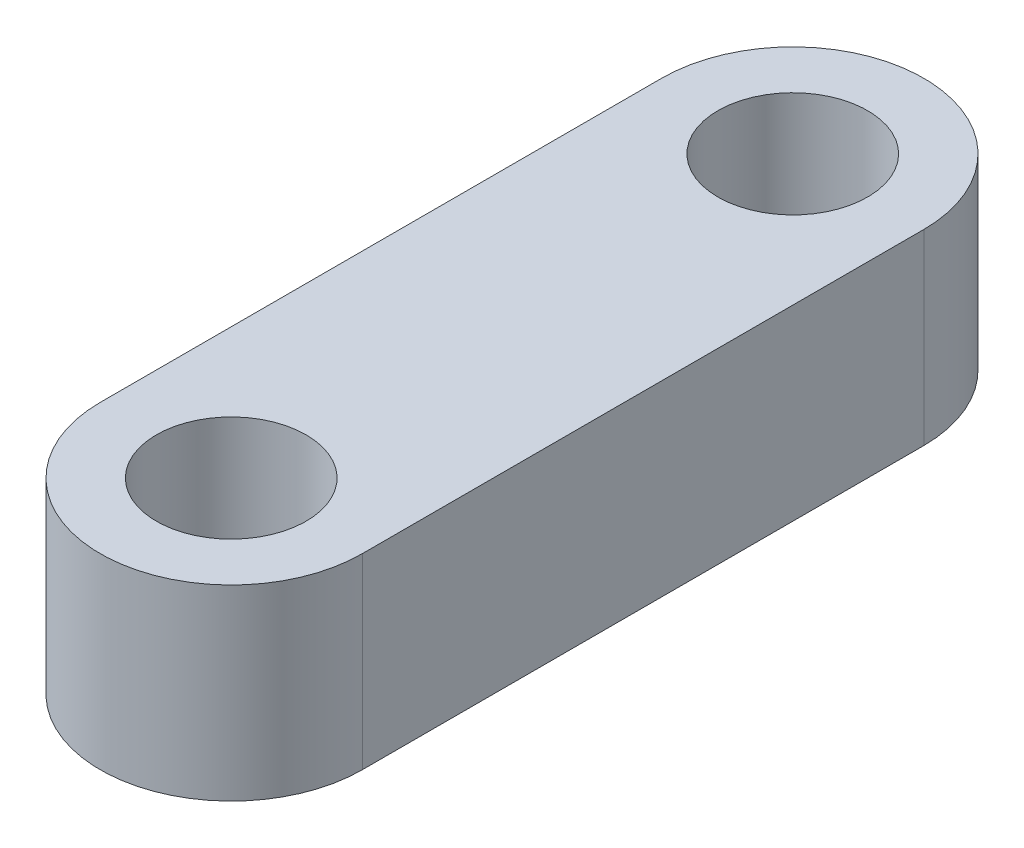
ISO-10303-21;
HEADER;
FILE_DESCRIPTION(('STEP AP214'),'2;1');
FILE_NAME('part.step','',(''),(''),'','','');
FILE_SCHEMA(('AUTOMOTIVE_DESIGN { 1 0 10303 214 1 1 1 1 }'));
ENDSEC;
DATA;
#1=APPLICATION_CONTEXT('core data for automotive mechanical design processes');
#2=APPLICATION_PROTOCOL_DEFINITION('international standard','automotive_design',2000,#1);
#3=PRODUCT_CONTEXT('',#1,'mechanical');
#4=PRODUCT('Part','Part','',(#3));
#5=PRODUCT_RELATED_PRODUCT_CATEGORY('part','',(#4));
#6=PRODUCT_DEFINITION_FORMATION('','',#4);
#7=PRODUCT_DEFINITION_CONTEXT('part definition',#1,'design');
#8=PRODUCT_DEFINITION('design','',#6,#7);
#9=PRODUCT_DEFINITION_SHAPE('','',#8);
#10=(LENGTH_UNIT() NAMED_UNIT(*) SI_UNIT(.MILLI.,.METRE.));
#11=(NAMED_UNIT(*) PLANE_ANGLE_UNIT() SI_UNIT($,.RADIAN.));
#12=(NAMED_UNIT(*) SI_UNIT($,.STERADIAN.) SOLID_ANGLE_UNIT());
#13=UNCERTAINTY_MEASURE_WITH_UNIT(LENGTH_MEASURE(1.E-05),#10,'distance_accuracy_value','');
#14=(GEOMETRIC_REPRESENTATION_CONTEXT(3) GLOBAL_UNCERTAINTY_ASSIGNED_CONTEXT((#13)) GLOBAL_UNIT_ASSIGNED_CONTEXT((#10,
#11,#12)) REPRESENTATION_CONTEXT('',''));
#15=CARTESIAN_POINT('',(0.,0.,0.));
#16=DIRECTION('',(0.,0.,1.));
#17=DIRECTION('',(1.,0.,0.));
#18=AXIS2_PLACEMENT_3D('',#15,#16,#17);
#19=CARTESIAN_POINT('',(15.0000000000001,5.,42.0731648092116));
#20=DIRECTION('',(0.,-1.,0.));
#21=DIRECTION('',(0.,0.,-1.));
#22=AXIS2_PLACEMENT_3D('',#19,#20,#21);
#23=PLANE('',#22);
#24=CARTESIAN_POINT('',(15.0000000000001,5.,57.0731648092116));
#25=DIRECTION('',(0.,1.,0.));
#26=DIRECTION('',(0.,0.,-1.));
#27=AXIS2_PLACEMENT_3D('',#24,#25,#26);
#28=CIRCLE('',#27,2.00000000000001);
#29=CARTESIAN_POINT('',(15.0000000000001,5.,55.0731648092116));
#30=VERTEX_POINT('',#29);
#31=EDGE_CURVE('E100',#30,#30,#28,.T.);
#32=ORIENTED_EDGE('',*,*,#31,.F.);
#33=EDGE_LOOP('',(#32));
#34=FACE_BOUND('',#33,.T.);
#35=CARTESIAN_POINT('',(15.0000000000001,5.,42.0731648092116));
#36=DIRECTION('',(0.,1.,0.));
#37=DIRECTION('',(0.,0.,-1.));
#38=AXIS2_PLACEMENT_3D('',#35,#36,#37);
#39=CIRCLE('',#38,3.5);
#40=CARTESIAN_POINT('',(18.5000000000001,5.,42.0731648092116));
#41=VERTEX_POINT('',#40);
#42=CARTESIAN_POINT('',(11.5000000000001,5.,42.0731648092116));
#43=VERTEX_POINT('',#42);
#44=EDGE_CURVE('E85',#41,#43,#39,.T.);
#45=ORIENTED_EDGE('',*,*,#44,.T.);
#46=DIRECTION('',(0.,0.,1.));
#47=VECTOR('',#46,1.);
#48=CARTESIAN_POINT('',(11.5000000000001,5.,42.0731648092116));
#49=LINE('',#48,#47);
#50=CARTESIAN_POINT('',(11.5000000000001,5.,57.0731648092116));
#51=VERTEX_POINT('',#50);
#52=EDGE_CURVE('E80',#43,#51,#49,.T.);
#53=ORIENTED_EDGE('',*,*,#52,.T.);
#54=CARTESIAN_POINT('',(15.0000000000001,5.,57.0731648092116));
#55=DIRECTION('',(0.,1.,0.));
#56=DIRECTION('',(0.,0.,1.));
#57=AXIS2_PLACEMENT_3D('',#54,#55,#56);
#58=CIRCLE('',#57,3.5);
#59=CARTESIAN_POINT('',(18.5000000000001,5.,57.0731648092116));
#60=VERTEX_POINT('',#59);
#61=EDGE_CURVE('E83',#51,#60,#58,.T.);
#62=ORIENTED_EDGE('',*,*,#61,.T.);
#63=DIRECTION('',(0.,0.,-1.));
#64=VECTOR('',#63,1.);
#65=CARTESIAN_POINT('',(18.5000000000001,5.,42.0731648092116));
#66=LINE('',#65,#64);
#67=EDGE_CURVE('E50',#60,#41,#66,.T.);
#68=ORIENTED_EDGE('',*,*,#67,.T.);
#69=EDGE_LOOP('',(#45,#53,#62,#68));
#70=FACE_BOUND('',#69,.T.);
#71=CARTESIAN_POINT('',(15.0000000000001,5.,42.0731648092116));
#72=DIRECTION('',(0.,1.,0.));
#73=DIRECTION('',(0.,0.,1.));
#74=AXIS2_PLACEMENT_3D('',#71,#72,#73);
#75=CIRCLE('',#74,2.);
#76=CARTESIAN_POINT('',(15.0000000000001,5.,44.0731648092116));
#77=VERTEX_POINT('',#76);
#78=EDGE_CURVE('E115',#77,#77,#75,.T.);
#79=ORIENTED_EDGE('',*,*,#78,.F.);
#80=EDGE_LOOP('',(#79));
#81=FACE_BOUND('',#80,.T.);
#82=ADVANCED_FACE('F33',(#34,#70,#81),#23,.F.);
#83=CARTESIAN_POINT('',(15.0000000000001,0.,42.0731648092116));
#84=DIRECTION('',(0.,-1.,0.));
#85=DIRECTION('',(0.,0.,-1.));
#86=AXIS2_PLACEMENT_3D('',#83,#84,#85);
#87=PLANE('',#86);
#88=CARTESIAN_POINT('',(15.0000000000001,0.,57.0731648092116));
#89=DIRECTION('',(0.,1.,0.));
#90=DIRECTION('',(0.,0.,-1.));
#91=AXIS2_PLACEMENT_3D('',#88,#89,#90);
#92=CIRCLE('',#91,2.00000000000001);
#93=CARTESIAN_POINT('',(15.0000000000001,0.,55.0731648092116));
#94=VERTEX_POINT('',#93);
#95=EDGE_CURVE('E112',#94,#94,#92,.T.);
#96=ORIENTED_EDGE('',*,*,#95,.T.);
#97=EDGE_LOOP('',(#96));
#98=FACE_BOUND('',#97,.T.);
#99=CARTESIAN_POINT('',(15.0000000000001,0.,42.0731648092116));
#100=DIRECTION('',(0.,1.,0.));
#101=DIRECTION('',(0.,0.,-1.));
#102=AXIS2_PLACEMENT_3D('',#99,#100,#101);
#103=CIRCLE('',#102,3.5);
#104=CARTESIAN_POINT('',(18.5000000000001,0.,42.0731648092116));
#105=VERTEX_POINT('',#104);
#106=CARTESIAN_POINT('',(11.5000000000001,0.,42.0731648092116));
#107=VERTEX_POINT('',#106);
#108=EDGE_CURVE('E97',#105,#107,#103,.T.);
#109=ORIENTED_EDGE('',*,*,#108,.F.);
#110=DIRECTION('',(0.,0.,-1.));
#111=VECTOR('',#110,1.);
#112=CARTESIAN_POINT('',(18.5000000000001,0.,42.0731648092116));
#113=LINE('',#112,#111);
#114=CARTESIAN_POINT('',(18.5000000000001,0.,57.0731648092116));
#115=VERTEX_POINT('',#114);
#116=EDGE_CURVE('E73',#115,#105,#113,.T.);
#117=ORIENTED_EDGE('',*,*,#116,.F.);
#118=CARTESIAN_POINT('',(15.0000000000001,0.,57.0731648092116));
#119=DIRECTION('',(0.,1.,0.));
#120=DIRECTION('',(0.,0.,1.));
#121=AXIS2_PLACEMENT_3D('',#118,#119,#120);
#122=CIRCLE('',#121,3.5);
#123=CARTESIAN_POINT('',(11.5000000000001,0.,57.0731648092116));
#124=VERTEX_POINT('',#123);
#125=EDGE_CURVE('E67',#124,#115,#122,.T.);
#126=ORIENTED_EDGE('',*,*,#125,.F.);
#127=DIRECTION('',(0.,0.,1.));
#128=VECTOR('',#127,1.);
#129=CARTESIAN_POINT('',(11.5000000000001,0.,42.0731648092116));
#130=LINE('',#129,#128);
#131=EDGE_CURVE('E89',#107,#124,#130,.T.);
#132=ORIENTED_EDGE('',*,*,#131,.F.);
#133=EDGE_LOOP('',(#109,#117,#126,#132));
#134=FACE_BOUND('',#133,.T.);
#135=CARTESIAN_POINT('',(15.0000000000001,0.,42.0731648092116));
#136=DIRECTION('',(0.,1.,0.));
#137=DIRECTION('',(0.,0.,1.));
#138=AXIS2_PLACEMENT_3D('',#135,#136,#137);
#139=CIRCLE('',#138,2.);
#140=CARTESIAN_POINT('',(15.0000000000001,0.,44.0731648092116));
#141=VERTEX_POINT('',#140);
#142=EDGE_CURVE('E118',#141,#141,#139,.T.);
#143=ORIENTED_EDGE('',*,*,#142,.T.);
#144=EDGE_LOOP('',(#143));
#145=FACE_BOUND('',#144,.T.);
#146=ADVANCED_FACE('F108',(#98,#134,#145),#87,.T.);
#147=CARTESIAN_POINT('',(15.0000000000001,5.,42.0731648092116));
#148=DIRECTION('',(0.,-1.,0.));
#149=DIRECTION('',(0.,0.,-1.));
#150=AXIS2_PLACEMENT_3D('',#147,#148,#149);
#151=CYLINDRICAL_SURFACE('',#150,3.5);
#152=ORIENTED_EDGE('',*,*,#108,.T.);
#153=DIRECTION('',(0.,-1.,0.));
#154=VECTOR('',#153,1.);
#155=CARTESIAN_POINT('',(11.5000000000001,5.,42.0731648092116));
#156=LINE('',#155,#154);
#157=EDGE_CURVE('E11',#43,#107,#156,.T.);
#158=ORIENTED_EDGE('',*,*,#157,.F.);
#159=ORIENTED_EDGE('',*,*,#44,.F.);
#160=DIRECTION('',(0.,-1.,0.));
#161=VECTOR('',#160,1.);
#162=CARTESIAN_POINT('',(18.5000000000001,5.,42.0731648092116));
#163=LINE('',#162,#161);
#164=EDGE_CURVE('E93',#41,#105,#163,.T.);
#165=ORIENTED_EDGE('',*,*,#164,.T.);
#166=EDGE_LOOP('',(#152,#158,#159,#165));
#167=FACE_BOUND('',#166,.T.);
#168=ADVANCED_FACE('F35',(#167),#151,.T.);
#169=CARTESIAN_POINT('',(11.5000000000001,5.,42.0731648092116));
#170=DIRECTION('',(1.,0.,0.));
#171=DIRECTION('',(0.,0.,-1.));
#172=AXIS2_PLACEMENT_3D('',#169,#170,#171);
#173=PLANE('',#172);
#174=ORIENTED_EDGE('',*,*,#131,.T.);
#175=DIRECTION('',(0.,-1.,0.));
#176=VECTOR('',#175,1.);
#177=CARTESIAN_POINT('',(11.5000000000001,5.,57.0731648092116));
#178=LINE('',#177,#176);
#179=EDGE_CURVE('E42',#51,#124,#178,.T.);
#180=ORIENTED_EDGE('',*,*,#179,.F.);
#181=ORIENTED_EDGE('',*,*,#52,.F.);
#182=ORIENTED_EDGE('',*,*,#157,.T.);
#183=EDGE_LOOP('',(#174,#180,#181,#182));
#184=FACE_BOUND('',#183,.T.);
#185=ADVANCED_FACE('F88',(#184),#173,.F.);
#186=CARTESIAN_POINT('',(15.0000000000001,5.,57.0731648092116));
#187=DIRECTION('',(0.,-1.,0.));
#188=DIRECTION('',(0.,0.,-1.));
#189=AXIS2_PLACEMENT_3D('',#186,#187,#188);
#190=CYLINDRICAL_SURFACE('',#189,3.5);
#191=ORIENTED_EDGE('',*,*,#125,.T.);
#192=DIRECTION('',(0.,-1.,0.));
#193=VECTOR('',#192,1.);
#194=CARTESIAN_POINT('',(18.5000000000001,5.,57.0731648092116));
#195=LINE('',#194,#193);
#196=EDGE_CURVE('E90',#60,#115,#195,.T.);
#197=ORIENTED_EDGE('',*,*,#196,.F.);
#198=ORIENTED_EDGE('',*,*,#61,.F.);
#199=ORIENTED_EDGE('',*,*,#179,.T.);
#200=EDGE_LOOP('',(#191,#197,#198,#199));
#201=FACE_BOUND('',#200,.T.);
#202=ADVANCED_FACE('F91',(#201),#190,.T.);
#203=CARTESIAN_POINT('',(18.5000000000001,5.,42.0731648092116));
#204=DIRECTION('',(-1.,0.,0.));
#205=DIRECTION('',(0.,0.,1.));
#206=AXIS2_PLACEMENT_3D('',#203,#204,#205);
#207=PLANE('',#206);
#208=ORIENTED_EDGE('',*,*,#116,.T.);
#209=ORIENTED_EDGE('',*,*,#164,.F.);
#210=ORIENTED_EDGE('',*,*,#67,.F.);
#211=ORIENTED_EDGE('',*,*,#196,.T.);
#212=EDGE_LOOP('',(#208,#209,#210,#211));
#213=FACE_BOUND('',#212,.T.);
#214=ADVANCED_FACE('F105',(#213),#207,.F.);
#215=CARTESIAN_POINT('',(15.0000000000001,5.,57.0731648092116));
#216=DIRECTION('',(0.,-1.,0.));
#217=DIRECTION('',(0.,0.,-1.));
#218=AXIS2_PLACEMENT_3D('',#215,#216,#217);
#219=CYLINDRICAL_SURFACE('',#218,2.00000000000001);
#220=ORIENTED_EDGE('',*,*,#31,.T.);
#221=EDGE_LOOP('',(#220));
#222=FACE_BOUND('',#221,.T.);
#223=ORIENTED_EDGE('',*,*,#95,.F.);
#224=EDGE_LOOP('',(#223));
#225=FACE_BOUND('',#224,.T.);
#226=ADVANCED_FACE('F136',(#222,#225),#219,.F.);
#227=CARTESIAN_POINT('',(15.0000000000001,5.,42.0731648092116));
#228=DIRECTION('',(0.,-1.,0.));
#229=DIRECTION('',(0.,0.,-1.));
#230=AXIS2_PLACEMENT_3D('',#227,#228,#229);
#231=CYLINDRICAL_SURFACE('',#230,2.);
#232=ORIENTED_EDGE('',*,*,#78,.T.);
#233=EDGE_LOOP('',(#232));
#234=FACE_BOUND('',#233,.T.);
#235=ORIENTED_EDGE('',*,*,#142,.F.);
#236=EDGE_LOOP('',(#235));
#237=FACE_BOUND('',#236,.T.);
#238=ADVANCED_FACE('F124',(#234,#237),#231,.F.);
#239=CLOSED_SHELL('',(#82,#146,#168,#185,#202,#214,#226,#238));
#240=MANIFOLD_SOLID_BREP('B2',#239);
#241=ADVANCED_BREP_SHAPE_REPRESENTATION('',(#18,#240),#14);
#242=SHAPE_DEFINITION_REPRESENTATION(#9,#241);
ENDSEC;
END-ISO-10303-21;
